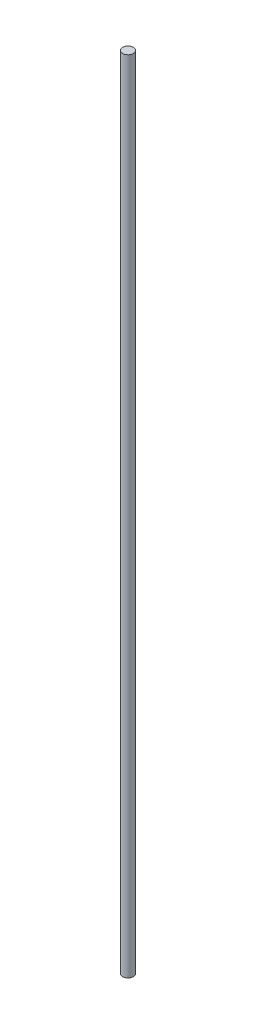
ISO-10303-21;
HEADER;
FILE_DESCRIPTION(('STEP AP214'),'2;1');
FILE_NAME('part.step','',(''),(''),'','','');
FILE_SCHEMA(('AUTOMOTIVE_DESIGN { 1 0 10303 214 1 1 1 1 }'));
ENDSEC;
DATA;
#1=APPLICATION_CONTEXT('core data for automotive mechanical design processes');
#2=APPLICATION_PROTOCOL_DEFINITION('international standard','automotive_design',2000,#1);
#3=PRODUCT_CONTEXT('',#1,'mechanical');
#4=PRODUCT('Part','Part','',(#3));
#5=PRODUCT_RELATED_PRODUCT_CATEGORY('part','',(#4));
#6=PRODUCT_DEFINITION_FORMATION('','',#4);
#7=PRODUCT_DEFINITION_CONTEXT('part definition',#1,'design');
#8=PRODUCT_DEFINITION('design','',#6,#7);
#9=PRODUCT_DEFINITION_SHAPE('','',#8);
#10=(LENGTH_UNIT() NAMED_UNIT(*) SI_UNIT(.MILLI.,.METRE.));
#11=(NAMED_UNIT(*) PLANE_ANGLE_UNIT() SI_UNIT($,.RADIAN.));
#12=(NAMED_UNIT(*) SI_UNIT($,.STERADIAN.) SOLID_ANGLE_UNIT());
#13=UNCERTAINTY_MEASURE_WITH_UNIT(LENGTH_MEASURE(1.E-05),#10,'distance_accuracy_value','');
#14=(GEOMETRIC_REPRESENTATION_CONTEXT(3) GLOBAL_UNCERTAINTY_ASSIGNED_CONTEXT((#13)) GLOBAL_UNIT_ASSIGNED_CONTEXT((#10,
#11,#12)) REPRESENTATION_CONTEXT('',''));
#15=CARTESIAN_POINT('',(0.,0.,0.));
#16=DIRECTION('',(0.,0.,1.));
#17=DIRECTION('',(1.,0.,0.));
#18=AXIS2_PLACEMENT_3D('',#15,#16,#17);
#19=CARTESIAN_POINT('',(0.,595.,0.));
#20=DIRECTION('',(0.,-1.,0.));
#21=DIRECTION('',(0.,0.,-1.));
#22=AXIS2_PLACEMENT_3D('',#19,#20,#21);
#23=CYLINDRICAL_SURFACE('',#22,4.);
#24=CARTESIAN_POINT('',(0.,595.,0.));
#25=DIRECTION('',(0.,1.,0.));
#26=DIRECTION('',(0.,0.,1.));
#27=AXIS2_PLACEMENT_3D('',#24,#25,#26);
#28=CIRCLE('',#27,4.);
#29=CARTESIAN_POINT('',(0.,595.,4.));
#30=VERTEX_POINT('',#29);
#31=EDGE_CURVE('E10',#30,#30,#28,.T.);
#32=ORIENTED_EDGE('',*,*,#31,.F.);
#33=EDGE_LOOP('',(#32));
#34=FACE_BOUND('',#33,.T.);
#35=CARTESIAN_POINT('',(0.,0.,0.));
#36=DIRECTION('',(0.,1.,0.));
#37=DIRECTION('',(0.,0.,1.));
#38=AXIS2_PLACEMENT_3D('',#35,#36,#37);
#39=CIRCLE('',#38,4.);
#40=CARTESIAN_POINT('',(0.,0.,4.));
#41=VERTEX_POINT('',#40);
#42=EDGE_CURVE('E44',#41,#41,#39,.T.);
#43=ORIENTED_EDGE('',*,*,#42,.T.);
#44=EDGE_LOOP('',(#43));
#45=FACE_BOUND('',#44,.T.);
#46=ADVANCED_FACE('F41',(#34,#45),#23,.T.);
#47=CARTESIAN_POINT('',(0.,595.,0.));
#48=DIRECTION('',(0.,1.,0.));
#49=DIRECTION('',(0.,0.,1.));
#50=AXIS2_PLACEMENT_3D('',#47,#48,#49);
#51=PLANE('',#50);
#52=ORIENTED_EDGE('',*,*,#31,.T.);
#53=EDGE_LOOP('',(#52));
#54=FACE_BOUND('',#53,.T.);
#55=ADVANCED_FACE('F58',(#54),#51,.T.);
#56=CARTESIAN_POINT('',(0.,0.,0.));
#57=DIRECTION('',(0.,1.,0.));
#58=DIRECTION('',(0.,0.,1.));
#59=AXIS2_PLACEMENT_3D('',#56,#57,#58);
#60=PLANE('',#59);
#61=ORIENTED_EDGE('',*,*,#42,.F.);
#62=EDGE_LOOP('',(#61));
#63=FACE_BOUND('',#62,.T.);
#64=ADVANCED_FACE('F56',(#63),#60,.F.);
#65=CLOSED_SHELL('',(#46,#55,#64));
#66=MANIFOLD_SOLID_BREP('B2',#65);
#67=ADVANCED_BREP_SHAPE_REPRESENTATION('',(#18,#66),#14);
#68=SHAPE_DEFINITION_REPRESENTATION(#9,#67);
ENDSEC;
END-ISO-10303-21;
